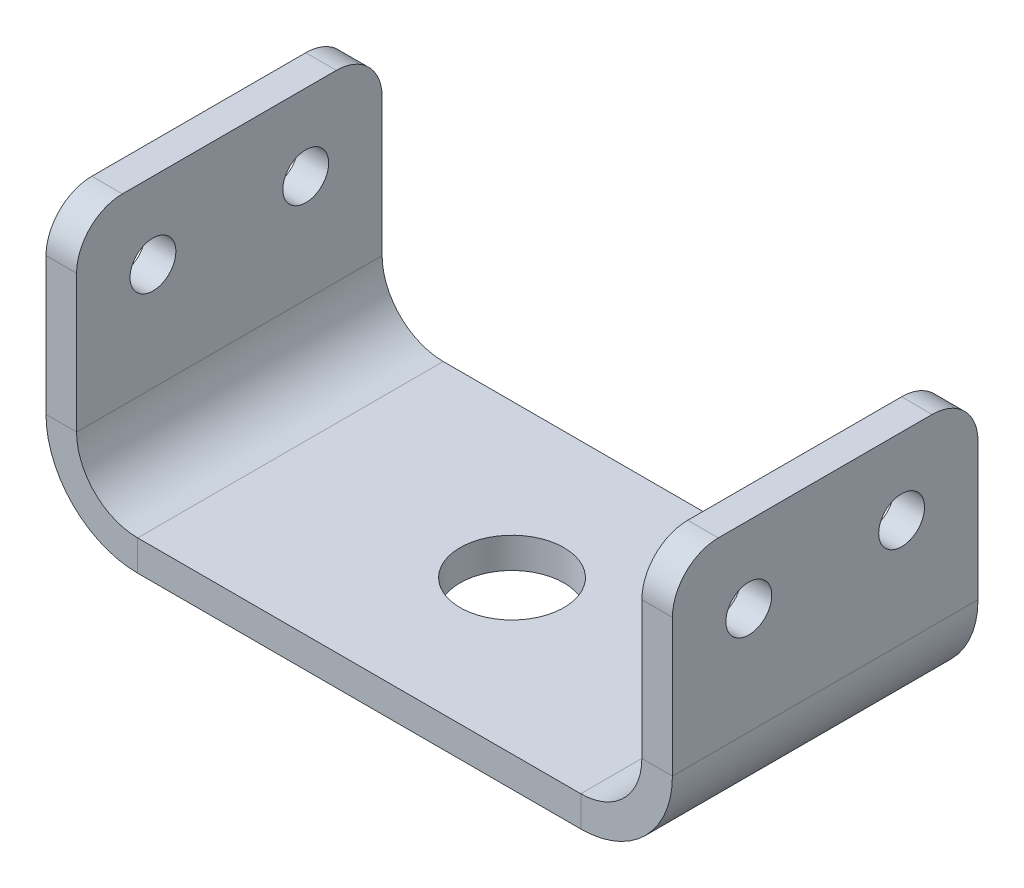
ISO-10303-21;
HEADER;
FILE_DESCRIPTION(('STEP AP214'),'2;1');
FILE_NAME('part.step','',(''),(''),'','','');
FILE_SCHEMA(('AUTOMOTIVE_DESIGN { 1 0 10303 214 1 1 1 1 }'));
ENDSEC;
DATA;
#1=APPLICATION_CONTEXT('core data for automotive mechanical design processes');
#2=APPLICATION_PROTOCOL_DEFINITION('international standard','automotive_design',2000,#1);
#3=PRODUCT_CONTEXT('',#1,'mechanical');
#4=PRODUCT('Part','Part','',(#3));
#5=PRODUCT_RELATED_PRODUCT_CATEGORY('part','',(#4));
#6=PRODUCT_DEFINITION_FORMATION('','',#4);
#7=PRODUCT_DEFINITION_CONTEXT('part definition',#1,'design');
#8=PRODUCT_DEFINITION('design','',#6,#7);
#9=PRODUCT_DEFINITION_SHAPE('','',#8);
#10=(LENGTH_UNIT() NAMED_UNIT(*) SI_UNIT(.MILLI.,.METRE.));
#11=(NAMED_UNIT(*) PLANE_ANGLE_UNIT() SI_UNIT($,.RADIAN.));
#12=(NAMED_UNIT(*) SI_UNIT($,.STERADIAN.) SOLID_ANGLE_UNIT());
#13=UNCERTAINTY_MEASURE_WITH_UNIT(LENGTH_MEASURE(1.E-05),#10,'distance_accuracy_value','');
#14=(GEOMETRIC_REPRESENTATION_CONTEXT(3) GLOBAL_UNCERTAINTY_ASSIGNED_CONTEXT((#13)) GLOBAL_UNIT_ASSIGNED_CONTEXT((#10,
#11,#12)) REPRESENTATION_CONTEXT('',''));
#15=CARTESIAN_POINT('',(0.,0.,0.));
#16=DIRECTION('',(0.,0.,1.));
#17=DIRECTION('',(1.,0.,0.));
#18=AXIS2_PLACEMENT_3D('',#15,#16,#17);
#19=CARTESIAN_POINT('',(20.5,-6.,-10.));
#20=DIRECTION('',(0.,1.,0.));
#21=DIRECTION('',(0.,0.,1.));
#22=AXIS2_PLACEMENT_3D('',#19,#20,#21);
#23=PLANE('',#22);
#24=DIRECTION('',(-1.,0.,0.));
#25=VECTOR('',#24,1.);
#26=CARTESIAN_POINT('',(20.5,-6.,10.));
#27=LINE('',#26,#25);
#28=CARTESIAN_POINT('',(14.5,-6.,10.));
#29=VERTEX_POINT('',#28);
#30=CARTESIAN_POINT('',(-14.5,-6.,10.));
#31=VERTEX_POINT('',#30);
#32=EDGE_CURVE('E129',#29,#31,#27,.T.);
#33=ORIENTED_EDGE('',*,*,#32,.T.);
#34=DIRECTION('',(0.,0.,-1.));
#35=VECTOR('',#34,1.);
#36=CARTESIAN_POINT('',(-14.5,-6.,-10.));
#37=LINE('',#36,#35);
#38=CARTESIAN_POINT('',(-14.5,-6.,-10.));
#39=VERTEX_POINT('',#38);
#40=EDGE_CURVE('E248',#31,#39,#37,.T.);
#41=ORIENTED_EDGE('',*,*,#40,.T.);
#42=DIRECTION('',(-1.,0.,0.));
#43=VECTOR('',#42,1.);
#44=CARTESIAN_POINT('',(20.5,-6.,-10.));
#45=LINE('',#44,#43);
#46=CARTESIAN_POINT('',(14.5,-6.,-10.));
#47=VERTEX_POINT('',#46);
#48=EDGE_CURVE('E404',#47,#39,#45,.T.);
#49=ORIENTED_EDGE('',*,*,#48,.F.);
#50=DIRECTION('',(0.,0.,-1.));
#51=VECTOR('',#50,1.);
#52=CARTESIAN_POINT('',(14.5,-6.,-10.));
#53=LINE('',#52,#51);
#54=EDGE_CURVE('E257',#47,#29,#53,.F.);
#55=ORIENTED_EDGE('',*,*,#54,.T.);
#56=EDGE_LOOP('',(#33,#41,#49,#55));
#57=FACE_BOUND('',#56,.T.);
#58=CARTESIAN_POINT('',(0.,-6.,0.));
#59=DIRECTION('',(0.,1.,0.));
#60=DIRECTION('',(0.,0.,1.));
#61=AXIS2_PLACEMENT_3D('',#58,#59,#60);
#62=CIRCLE('',#61,4.76488561011312);
#63=CARTESIAN_POINT('',(0.,-6.,4.76488561011311));
#64=VERTEX_POINT('',#63);
#65=EDGE_CURVE('E11',#64,#64,#62,.F.);
#66=ORIENTED_EDGE('',*,*,#65,.F.);
#67=EDGE_LOOP('',(#66));
#68=FACE_BOUND('',#67,.T.);
#69=ADVANCED_FACE('F50',(#57,#68),#23,.F.);
#70=CARTESIAN_POINT('',(20.5,-6.,10.));
#71=DIRECTION('',(0.,0.,-1.));
#72=DIRECTION('',(-1.,0.,0.));
#73=AXIS2_PLACEMENT_3D('',#70,#71,#72);
#74=PLANE('',#73);
#75=DIRECTION('',(0.,-1.,0.));
#76=VECTOR('',#75,1.);
#77=CARTESIAN_POINT('',(14.5,-6.,10.));
#78=LINE('',#77,#76);
#79=CARTESIAN_POINT('',(14.5,-4.,10.));
#80=VERTEX_POINT('',#79);
#81=EDGE_CURVE('E60',#80,#29,#78,.T.);
#82=ORIENTED_EDGE('',*,*,#81,.F.);
#83=DIRECTION('',(1.,0.,0.));
#84=VECTOR('',#83,1.);
#85=CARTESIAN_POINT('',(20.5,-4.,10.));
#86=LINE('',#85,#84);
#87=CARTESIAN_POINT('',(-14.5,-4.,10.));
#88=VERTEX_POINT('',#87);
#89=EDGE_CURVE('E126',#80,#88,#86,.F.);
#90=ORIENTED_EDGE('',*,*,#89,.T.);
#91=DIRECTION('',(0.,-1.,0.));
#92=VECTOR('',#91,1.);
#93=CARTESIAN_POINT('',(-14.5,-6.,10.));
#94=LINE('',#93,#92);
#95=EDGE_CURVE('E136',#88,#31,#94,.T.);
#96=ORIENTED_EDGE('',*,*,#95,.T.);
#97=ORIENTED_EDGE('',*,*,#32,.F.);
#98=EDGE_LOOP('',(#82,#90,#96,#97));
#99=FACE_BOUND('',#98,.T.);
#100=ADVANCED_FACE('F123',(#99),#74,.F.);
#101=CARTESIAN_POINT('',(-14.5,0.,10.));
#102=DIRECTION('',(0.,0.,1.));
#103=DIRECTION('',(1.,0.,0.));
#104=AXIS2_PLACEMENT_3D('',#101,#102,#103);
#105=PLANE('',#104);
#106=ORIENTED_EDGE('',*,*,#95,.F.);
#107=CARTESIAN_POINT('',(-14.5,0.,10.));
#108=DIRECTION('',(0.,0.,1.));
#109=DIRECTION('',(0.,-1.,0.));
#110=AXIS2_PLACEMENT_3D('',#107,#108,#109);
#111=CIRCLE('',#110,4.);
#112=CARTESIAN_POINT('',(-18.5,0.,10.));
#113=VERTEX_POINT('',#112);
#114=EDGE_CURVE('E177',#88,#113,#111,.F.);
#115=ORIENTED_EDGE('',*,*,#114,.T.);
#116=DIRECTION('',(-1.,0.,0.));
#117=VECTOR('',#116,1.);
#118=CARTESIAN_POINT('',(-20.5,0.,10.));
#119=LINE('',#118,#117);
#120=CARTESIAN_POINT('',(-20.5,0.,10.));
#121=VERTEX_POINT('',#120);
#122=EDGE_CURVE('E68',#113,#121,#119,.T.);
#123=ORIENTED_EDGE('',*,*,#122,.T.);
#124=CARTESIAN_POINT('',(-14.5,0.,10.));
#125=DIRECTION('',(0.,0.,-1.));
#126=DIRECTION('',(-1.,0.,0.));
#127=AXIS2_PLACEMENT_3D('',#124,#125,#126);
#128=CIRCLE('',#127,6.);
#129=EDGE_CURVE('E265',#31,#121,#128,.T.);
#130=ORIENTED_EDGE('',*,*,#129,.F.);
#131=EDGE_LOOP('',(#106,#115,#123,#130));
#132=FACE_BOUND('',#131,.T.);
#133=ADVANCED_FACE('F330',(#132),#105,.T.);
#134=CARTESIAN_POINT('',(-20.5,0.,10.));
#135=DIRECTION('',(0.,0.,-1.));
#136=DIRECTION('',(0.,-1.,0.));
#137=AXIS2_PLACEMENT_3D('',#134,#135,#136);
#138=PLANE('',#137);
#139=ORIENTED_EDGE('',*,*,#122,.F.);
#140=DIRECTION('',(0.,1.,0.));
#141=VECTOR('',#140,1.);
#142=CARTESIAN_POINT('',(-18.5,0.,10.));
#143=LINE('',#142,#141);
#144=CARTESIAN_POINT('',(-18.5,9.,10.));
#145=VERTEX_POINT('',#144);
#146=EDGE_CURVE('E315',#145,#113,#143,.F.);
#147=ORIENTED_EDGE('',*,*,#146,.F.);
#148=DIRECTION('',(-1.,0.,0.));
#149=VECTOR('',#148,1.);
#150=CARTESIAN_POINT('',(-20.5,9.,10.));
#151=LINE('',#150,#149);
#152=CARTESIAN_POINT('',(-20.5,9.,10.));
#153=VERTEX_POINT('',#152);
#154=EDGE_CURVE('E232',#145,#153,#151,.T.);
#155=ORIENTED_EDGE('',*,*,#154,.T.);
#156=DIRECTION('',(0.,-1.,0.));
#157=VECTOR('',#156,1.);
#158=CARTESIAN_POINT('',(-20.5,0.,10.));
#159=LINE('',#158,#157);
#160=EDGE_CURVE('E344',#153,#121,#159,.T.);
#161=ORIENTED_EDGE('',*,*,#160,.T.);
#162=EDGE_LOOP('',(#139,#147,#155,#161));
#163=FACE_BOUND('',#162,.T.);
#164=ADVANCED_FACE('F341',(#163),#138,.F.);
#165=CARTESIAN_POINT('',(-20.5,9.,7.));
#166=DIRECTION('',(-1.,0.,0.));
#167=DIRECTION('',(0.,0.,1.));
#168=AXIS2_PLACEMENT_3D('',#165,#166,#167);
#169=CYLINDRICAL_SURFACE('',#168,3.);
#170=ORIENTED_EDGE('',*,*,#154,.F.);
#171=CARTESIAN_POINT('',(-18.5,9.,7.));
#172=DIRECTION('',(-1.,0.,0.));
#173=DIRECTION('',(0.,0.,1.));
#174=AXIS2_PLACEMENT_3D('',#171,#172,#173);
#175=CIRCLE('',#174,3.);
#176=CARTESIAN_POINT('',(-18.5,12.,7.));
#177=VERTEX_POINT('',#176);
#178=EDGE_CURVE('E283',#145,#177,#175,.T.);
#179=ORIENTED_EDGE('',*,*,#178,.T.);
#180=DIRECTION('',(-1.,0.,0.));
#181=VECTOR('',#180,1.);
#182=CARTESIAN_POINT('',(-20.5,12.,7.));
#183=LINE('',#182,#181);
#184=CARTESIAN_POINT('',(-20.5,12.,7.));
#185=VERTEX_POINT('',#184);
#186=EDGE_CURVE('E228',#177,#185,#183,.T.);
#187=ORIENTED_EDGE('',*,*,#186,.T.);
#188=CARTESIAN_POINT('',(-20.5,9.,7.));
#189=DIRECTION('',(-1.,0.,0.));
#190=DIRECTION('',(0.,0.,1.));
#191=AXIS2_PLACEMENT_3D('',#188,#189,#190);
#192=CIRCLE('',#191,3.);
#193=EDGE_CURVE('E348',#153,#185,#192,.T.);
#194=ORIENTED_EDGE('',*,*,#193,.F.);
#195=EDGE_LOOP('',(#170,#179,#187,#194));
#196=FACE_BOUND('',#195,.T.);
#197=ADVANCED_FACE('F469',(#196),#169,.T.);
#198=CARTESIAN_POINT('',(-20.5,12.,-10.));
#199=DIRECTION('',(0.,-1.,0.));
#200=DIRECTION('',(0.,0.,1.));
#201=AXIS2_PLACEMENT_3D('',#198,#199,#200);
#202=PLANE('',#201);
#203=ORIENTED_EDGE('',*,*,#186,.F.);
#204=DIRECTION('',(0.,0.,1.));
#205=VECTOR('',#204,1.);
#206=CARTESIAN_POINT('',(-18.5,12.,0.));
#207=LINE('',#206,#205);
#208=CARTESIAN_POINT('',(-18.5,12.,-6.99999999999999));
#209=VERTEX_POINT('',#208);
#210=EDGE_CURVE('E188',#209,#177,#207,.T.);
#211=ORIENTED_EDGE('',*,*,#210,.F.);
#212=DIRECTION('',(-1.,0.,0.));
#213=VECTOR('',#212,1.);
#214=CARTESIAN_POINT('',(-20.5,12.,-6.99999999999999));
#215=LINE('',#214,#213);
#216=CARTESIAN_POINT('',(-20.5,12.,-6.99999999999999));
#217=VERTEX_POINT('',#216);
#218=EDGE_CURVE('E224',#209,#217,#215,.T.);
#219=ORIENTED_EDGE('',*,*,#218,.T.);
#220=DIRECTION('',(0.,0.,1.));
#221=VECTOR('',#220,1.);
#222=CARTESIAN_POINT('',(-20.5,12.,-10.));
#223=LINE('',#222,#221);
#224=EDGE_CURVE('E423',#217,#185,#223,.T.);
#225=ORIENTED_EDGE('',*,*,#224,.T.);
#226=EDGE_LOOP('',(#203,#211,#219,#225));
#227=FACE_BOUND('',#226,.T.);
#228=ADVANCED_FACE('F465',(#227),#202,.F.);
#229=CARTESIAN_POINT('',(-20.5,9.,-6.99999999999999));
#230=DIRECTION('',(-1.,0.,0.));
#231=DIRECTION('',(0.,0.,1.));
#232=AXIS2_PLACEMENT_3D('',#229,#230,#231);
#233=CYLINDRICAL_SURFACE('',#232,3.);
#234=ORIENTED_EDGE('',*,*,#218,.F.);
#235=CARTESIAN_POINT('',(-18.5,9.,-6.99999999999999));
#236=DIRECTION('',(-1.,0.,0.));
#237=DIRECTION('',(0.,0.,1.));
#238=AXIS2_PLACEMENT_3D('',#235,#236,#237);
#239=CIRCLE('',#238,3.);
#240=CARTESIAN_POINT('',(-18.5,9.,-9.99999999999999));
#241=VERTEX_POINT('',#240);
#242=EDGE_CURVE('E316',#209,#241,#239,.T.);
#243=ORIENTED_EDGE('',*,*,#242,.T.);
#244=DIRECTION('',(-1.,0.,0.));
#245=VECTOR('',#244,1.);
#246=CARTESIAN_POINT('',(-20.5,9.,-9.99999999999999));
#247=LINE('',#246,#245);
#248=CARTESIAN_POINT('',(-20.5,9.,-9.99999999999999));
#249=VERTEX_POINT('',#248);
#250=EDGE_CURVE('E220',#241,#249,#247,.T.);
#251=ORIENTED_EDGE('',*,*,#250,.T.);
#252=CARTESIAN_POINT('',(-20.5,9.,-6.99999999999999));
#253=DIRECTION('',(-1.,0.,0.));
#254=DIRECTION('',(0.,0.,1.));
#255=AXIS2_PLACEMENT_3D('',#252,#253,#254);
#256=CIRCLE('',#255,3.);
#257=EDGE_CURVE('E357',#217,#249,#256,.T.);
#258=ORIENTED_EDGE('',*,*,#257,.F.);
#259=EDGE_LOOP('',(#234,#243,#251,#258));
#260=FACE_BOUND('',#259,.T.);
#261=ADVANCED_FACE('F467',(#260),#233,.T.);
#262=CARTESIAN_POINT('',(-20.5,0.,-10.));
#263=DIRECTION('',(0.,0.,1.));
#264=DIRECTION('',(0.,1.,0.));
#265=AXIS2_PLACEMENT_3D('',#262,#263,#264);
#266=PLANE('',#265);
#267=ORIENTED_EDGE('',*,*,#250,.F.);
#268=DIRECTION('',(0.,1.,0.));
#269=VECTOR('',#268,1.);
#270=CARTESIAN_POINT('',(-18.5,0.,-10.));
#271=LINE('',#270,#269);
#272=CARTESIAN_POINT('',(-18.5,0.,-10.));
#273=VERTEX_POINT('',#272);
#274=EDGE_CURVE('E311',#273,#241,#271,.T.);
#275=ORIENTED_EDGE('',*,*,#274,.F.);
#276=DIRECTION('',(-1.,0.,0.));
#277=VECTOR('',#276,1.);
#278=CARTESIAN_POINT('',(-20.5,0.,-10.));
#279=LINE('',#278,#277);
#280=CARTESIAN_POINT('',(-20.5,0.,-10.));
#281=VERTEX_POINT('',#280);
#282=EDGE_CURVE('E217',#273,#281,#279,.T.);
#283=ORIENTED_EDGE('',*,*,#282,.T.);
#284=DIRECTION('',(0.,1.,0.));
#285=VECTOR('',#284,1.);
#286=CARTESIAN_POINT('',(-20.5,0.,-10.));
#287=LINE('',#286,#285);
#288=EDGE_CURVE('E349',#281,#249,#287,.T.);
#289=ORIENTED_EDGE('',*,*,#288,.T.);
#290=EDGE_LOOP('',(#267,#275,#283,#289));
#291=FACE_BOUND('',#290,.T.);
#292=ADVANCED_FACE('F437',(#291),#266,.F.);
#293=CARTESIAN_POINT('',(-14.5,0.,-10.));
#294=DIRECTION('',(0.,0.,1.));
#295=DIRECTION('',(0.,-1.,0.));
#296=AXIS2_PLACEMENT_3D('',#293,#294,#295);
#297=PLANE('',#296);
#298=ORIENTED_EDGE('',*,*,#282,.F.);
#299=CARTESIAN_POINT('',(-14.5,0.,-10.));
#300=DIRECTION('',(0.,0.,1.));
#301=DIRECTION('',(0.,-1.,0.));
#302=AXIS2_PLACEMENT_3D('',#299,#300,#301);
#303=CIRCLE('',#302,4.);
#304=CARTESIAN_POINT('',(-14.5,-4.,-10.));
#305=VERTEX_POINT('',#304);
#306=EDGE_CURVE('E307',#273,#305,#303,.T.);
#307=ORIENTED_EDGE('',*,*,#306,.T.);
#308=DIRECTION('',(0.,-1.,0.));
#309=VECTOR('',#308,1.);
#310=CARTESIAN_POINT('',(-14.5,-6.,-10.));
#311=LINE('',#310,#309);
#312=EDGE_CURVE('E213',#305,#39,#311,.T.);
#313=ORIENTED_EDGE('',*,*,#312,.T.);
#314=CARTESIAN_POINT('',(-14.5,0.,-10.));
#315=DIRECTION('',(0.,0.,-1.));
#316=DIRECTION('',(0.,1.,0.));
#317=AXIS2_PLACEMENT_3D('',#314,#315,#316);
#318=CIRCLE('',#317,6.);
#319=EDGE_CURVE('E261',#281,#39,#318,.F.);
#320=ORIENTED_EDGE('',*,*,#319,.F.);
#321=EDGE_LOOP('',(#298,#307,#313,#320));
#322=FACE_BOUND('',#321,.T.);
#323=ADVANCED_FACE('F439',(#322),#297,.F.);
#324=CARTESIAN_POINT('',(20.5,-6.,-10.));
#325=DIRECTION('',(0.,0.,-1.));
#326=DIRECTION('',(-1.,0.,0.));
#327=AXIS2_PLACEMENT_3D('',#324,#325,#326);
#328=PLANE('',#327);
#329=ORIENTED_EDGE('',*,*,#312,.F.);
#330=DIRECTION('',(1.,0.,0.));
#331=VECTOR('',#330,1.);
#332=CARTESIAN_POINT('',(20.5,-4.,-10.));
#333=LINE('',#332,#331);
#334=CARTESIAN_POINT('',(14.5,-4.,-10.));
#335=VERTEX_POINT('',#334);
#336=EDGE_CURVE('E162',#335,#305,#333,.F.);
#337=ORIENTED_EDGE('',*,*,#336,.F.);
#338=DIRECTION('',(0.,-1.,0.));
#339=VECTOR('',#338,1.);
#340=CARTESIAN_POINT('',(14.5,-6.,-10.));
#341=LINE('',#340,#339);
#342=EDGE_CURVE('E209',#335,#47,#341,.T.);
#343=ORIENTED_EDGE('',*,*,#342,.T.);
#344=ORIENTED_EDGE('',*,*,#48,.T.);
#345=EDGE_LOOP('',(#329,#337,#343,#344));
#346=FACE_BOUND('',#345,.T.);
#347=ADVANCED_FACE('F555',(#346),#328,.T.);
#348=CARTESIAN_POINT('',(14.5,0.,-10.));
#349=DIRECTION('',(0.,0.,-1.));
#350=DIRECTION('',(0.,1.,0.));
#351=AXIS2_PLACEMENT_3D('',#348,#349,#350);
#352=PLANE('',#351);
#353=ORIENTED_EDGE('',*,*,#342,.F.);
#354=CARTESIAN_POINT('',(14.5,0.,-10.));
#355=DIRECTION('',(0.,0.,-1.));
#356=DIRECTION('',(0.,1.,0.));
#357=AXIS2_PLACEMENT_3D('',#354,#355,#356);
#358=CIRCLE('',#357,4.);
#359=CARTESIAN_POINT('',(18.5,0.,-10.));
#360=VERTEX_POINT('',#359);
#361=EDGE_CURVE('E148',#335,#360,#358,.F.);
#362=ORIENTED_EDGE('',*,*,#361,.T.);
#363=DIRECTION('',(1.,0.,0.));
#364=VECTOR('',#363,1.);
#365=CARTESIAN_POINT('',(20.5,0.,-10.));
#366=LINE('',#365,#364);
#367=CARTESIAN_POINT('',(20.5,0.,-10.));
#368=VERTEX_POINT('',#367);
#369=EDGE_CURVE('E205',#360,#368,#366,.T.);
#370=ORIENTED_EDGE('',*,*,#369,.T.);
#371=CARTESIAN_POINT('',(14.5,0.,-10.));
#372=DIRECTION('',(0.,0.,1.));
#373=DIRECTION('',(0.,-1.,0.));
#374=AXIS2_PLACEMENT_3D('',#371,#372,#373);
#375=CIRCLE('',#374,6.);
#376=EDGE_CURVE('E269',#47,#368,#375,.T.);
#377=ORIENTED_EDGE('',*,*,#376,.F.);
#378=EDGE_LOOP('',(#353,#362,#370,#377));
#379=FACE_BOUND('',#378,.T.);
#380=ADVANCED_FACE('F551',(#379),#352,.T.);
#381=CARTESIAN_POINT('',(20.5,0.,-10.));
#382=DIRECTION('',(0.,0.,1.));
#383=DIRECTION('',(0.,1.,0.));
#384=AXIS2_PLACEMENT_3D('',#381,#382,#383);
#385=PLANE('',#384);
#386=ORIENTED_EDGE('',*,*,#369,.F.);
#387=DIRECTION('',(0.,1.,0.));
#388=VECTOR('',#387,1.);
#389=CARTESIAN_POINT('',(18.5,0.,-10.));
#390=LINE('',#389,#388);
#391=CARTESIAN_POINT('',(18.5,9.,-9.99999999999999));
#392=VERTEX_POINT('',#391);
#393=EDGE_CURVE('E291',#360,#392,#390,.T.);
#394=ORIENTED_EDGE('',*,*,#393,.T.);
#395=DIRECTION('',(1.,0.,0.));
#396=VECTOR('',#395,1.);
#397=CARTESIAN_POINT('',(20.5,9.,-9.99999999999999));
#398=LINE('',#397,#396);
#399=CARTESIAN_POINT('',(20.5,9.,-9.99999999999999));
#400=VERTEX_POINT('',#399);
#401=EDGE_CURVE('E201',#392,#400,#398,.T.);
#402=ORIENTED_EDGE('',*,*,#401,.T.);
#403=DIRECTION('',(0.,1.,0.));
#404=VECTOR('',#403,1.);
#405=CARTESIAN_POINT('',(20.5,0.,-10.));
#406=LINE('',#405,#404);
#407=EDGE_CURVE('E379',#368,#400,#406,.T.);
#408=ORIENTED_EDGE('',*,*,#407,.F.);
#409=EDGE_LOOP('',(#386,#394,#402,#408));
#410=FACE_BOUND('',#409,.T.);
#411=ADVANCED_FACE('F547',(#410),#385,.F.);
#412=CARTESIAN_POINT('',(20.5,9.,-6.99999999999999));
#413=DIRECTION('',(-1.,0.,0.));
#414=DIRECTION('',(0.,0.,1.));
#415=AXIS2_PLACEMENT_3D('',#412,#413,#414);
#416=CYLINDRICAL_SURFACE('',#415,3.);
#417=ORIENTED_EDGE('',*,*,#401,.F.);
#418=CARTESIAN_POINT('',(18.5,9.,-6.99999999999999));
#419=DIRECTION('',(-1.,0.,0.));
#420=DIRECTION('',(0.,0.,1.));
#421=AXIS2_PLACEMENT_3D('',#418,#419,#420);
#422=CIRCLE('',#421,3.);
#423=CARTESIAN_POINT('',(18.5,12.,-6.99999999999999));
#424=VERTEX_POINT('',#423);
#425=EDGE_CURVE('E271',#392,#424,#422,.F.);
#426=ORIENTED_EDGE('',*,*,#425,.T.);
#427=DIRECTION('',(1.,0.,0.));
#428=VECTOR('',#427,1.);
#429=CARTESIAN_POINT('',(20.5,12.,-6.99999999999999));
#430=LINE('',#429,#428);
#431=CARTESIAN_POINT('',(20.5,12.,-6.99999999999999));
#432=VERTEX_POINT('',#431);
#433=EDGE_CURVE('E197',#424,#432,#430,.T.);
#434=ORIENTED_EDGE('',*,*,#433,.T.);
#435=CARTESIAN_POINT('',(20.5,9.,-6.99999999999999));
#436=DIRECTION('',(-1.,0.,0.));
#437=DIRECTION('',(0.,0.,1.));
#438=AXIS2_PLACEMENT_3D('',#435,#436,#437);
#439=CIRCLE('',#438,3.);
#440=EDGE_CURVE('E383',#400,#432,#439,.F.);
#441=ORIENTED_EDGE('',*,*,#440,.F.);
#442=EDGE_LOOP('',(#417,#426,#434,#441));
#443=FACE_BOUND('',#442,.T.);
#444=ADVANCED_FACE('F543',(#443),#416,.T.);
#445=CARTESIAN_POINT('',(20.5,12.,-10.));
#446=DIRECTION('',(0.,1.,0.));
#447=DIRECTION('',(0.,0.,-1.));
#448=AXIS2_PLACEMENT_3D('',#445,#446,#447);
#449=PLANE('',#448);
#450=ORIENTED_EDGE('',*,*,#433,.F.);
#451=DIRECTION('',(0.,0.,1.));
#452=VECTOR('',#451,1.);
#453=CARTESIAN_POINT('',(18.5,12.,0.));
#454=LINE('',#453,#452);
#455=CARTESIAN_POINT('',(18.5,12.,7.));
#456=VERTEX_POINT('',#455);
#457=EDGE_CURVE('E287',#456,#424,#454,.F.);
#458=ORIENTED_EDGE('',*,*,#457,.F.);
#459=DIRECTION('',(1.,0.,0.));
#460=VECTOR('',#459,1.);
#461=CARTESIAN_POINT('',(20.5,12.,7.));
#462=LINE('',#461,#460);
#463=CARTESIAN_POINT('',(20.5,12.,7.));
#464=VERTEX_POINT('',#463);
#465=EDGE_CURVE('E193',#456,#464,#462,.T.);
#466=ORIENTED_EDGE('',*,*,#465,.T.);
#467=DIRECTION('',(0.,0.,-1.));
#468=VECTOR('',#467,1.);
#469=CARTESIAN_POINT('',(20.5,12.,-10.));
#470=LINE('',#469,#468);
#471=EDGE_CURVE('E368',#464,#432,#470,.T.);
#472=ORIENTED_EDGE('',*,*,#471,.T.);
#473=EDGE_LOOP('',(#450,#458,#466,#472));
#474=FACE_BOUND('',#473,.T.);
#475=ADVANCED_FACE('F539',(#474),#449,.T.);
#476=CARTESIAN_POINT('',(20.5,9.,7.));
#477=DIRECTION('',(-1.,0.,0.));
#478=DIRECTION('',(0.,0.,1.));
#479=AXIS2_PLACEMENT_3D('',#476,#477,#478);
#480=CYLINDRICAL_SURFACE('',#479,3.);
#481=ORIENTED_EDGE('',*,*,#465,.F.);
#482=CARTESIAN_POINT('',(18.5,9.,7.));
#483=DIRECTION('',(-1.,0.,0.));
#484=DIRECTION('',(0.,0.,1.));
#485=AXIS2_PLACEMENT_3D('',#482,#483,#484);
#486=CIRCLE('',#485,3.);
#487=CARTESIAN_POINT('',(18.5,9.,10.));
#488=VERTEX_POINT('',#487);
#489=EDGE_CURVE('E292',#456,#488,#486,.F.);
#490=ORIENTED_EDGE('',*,*,#489,.T.);
#491=DIRECTION('',(1.,0.,0.));
#492=VECTOR('',#491,1.);
#493=CARTESIAN_POINT('',(20.5,9.,10.));
#494=LINE('',#493,#492);
#495=CARTESIAN_POINT('',(20.5,9.,10.));
#496=VERTEX_POINT('',#495);
#497=EDGE_CURVE('E189',#488,#496,#494,.T.);
#498=ORIENTED_EDGE('',*,*,#497,.T.);
#499=CARTESIAN_POINT('',(20.5,9.,7.));
#500=DIRECTION('',(-1.,0.,0.));
#501=DIRECTION('',(0.,0.,1.));
#502=AXIS2_PLACEMENT_3D('',#499,#500,#501);
#503=CIRCLE('',#502,3.);
#504=EDGE_CURVE('E372',#464,#496,#503,.F.);
#505=ORIENTED_EDGE('',*,*,#504,.F.);
#506=EDGE_LOOP('',(#481,#490,#498,#505));
#507=FACE_BOUND('',#506,.T.);
#508=ADVANCED_FACE('F536',(#507),#480,.T.);
#509=CARTESIAN_POINT('',(20.5,0.,10.));
#510=DIRECTION('',(0.,0.,-1.));
#511=DIRECTION('',(0.,-1.,0.));
#512=AXIS2_PLACEMENT_3D('',#509,#510,#511);
#513=PLANE('',#512);
#514=ORIENTED_EDGE('',*,*,#497,.F.);
#515=DIRECTION('',(0.,1.,0.));
#516=VECTOR('',#515,1.);
#517=CARTESIAN_POINT('',(18.5,0.,10.));
#518=LINE('',#517,#516);
#519=CARTESIAN_POINT('',(18.5,0.,10.));
#520=VERTEX_POINT('',#519);
#521=EDGE_CURVE('E288',#488,#520,#518,.F.);
#522=ORIENTED_EDGE('',*,*,#521,.T.);
#523=DIRECTION('',(1.,0.,0.));
#524=VECTOR('',#523,1.);
#525=CARTESIAN_POINT('',(20.5,0.,10.));
#526=LINE('',#525,#524);
#527=CARTESIAN_POINT('',(20.5,0.,10.));
#528=VERTEX_POINT('',#527);
#529=EDGE_CURVE('E167',#520,#528,#526,.T.);
#530=ORIENTED_EDGE('',*,*,#529,.T.);
#531=DIRECTION('',(0.,-1.,0.));
#532=VECTOR('',#531,1.);
#533=CARTESIAN_POINT('',(20.5,0.,10.));
#534=LINE('',#533,#532);
#535=EDGE_CURVE('E376',#496,#528,#534,.T.);
#536=ORIENTED_EDGE('',*,*,#535,.F.);
#537=EDGE_LOOP('',(#514,#522,#530,#536));
#538=FACE_BOUND('',#537,.T.);
#539=ADVANCED_FACE('F532',(#538),#513,.F.);
#540=CARTESIAN_POINT('',(0.,-6.,0.));
#541=DIRECTION('',(0.,1.,0.));
#542=DIRECTION('',(0.,0.,1.));
#543=AXIS2_PLACEMENT_3D('',#540,#541,#542);
#544=CYLINDRICAL_SURFACE('',#543,3.4);
#545=CARTESIAN_POINT('',(0.,-6.,0.));
#546=DIRECTION('',(0.,-1.,0.));
#547=DIRECTION('',(0.,0.,-1.));
#548=AXIS2_PLACEMENT_3D('',#545,#546,#547);
#549=CIRCLE('',#548,3.4);
#550=CARTESIAN_POINT('',(0.,-6.,-3.4));
#551=VERTEX_POINT('',#550);
#552=EDGE_CURVE('E397',#551,#551,#549,.T.);
#553=ORIENTED_EDGE('',*,*,#552,.T.);
#554=EDGE_LOOP('',(#553));
#555=FACE_BOUND('',#554,.T.);
#556=CARTESIAN_POINT('',(0.,-4.,0.));
#557=DIRECTION('',(0.,-1.,0.));
#558=DIRECTION('',(0.,0.,-1.));
#559=AXIS2_PLACEMENT_3D('',#556,#557,#558);
#560=CIRCLE('',#559,3.4);
#561=CARTESIAN_POINT('',(0.,-4.,-3.4));
#562=VERTEX_POINT('',#561);
#563=EDGE_CURVE('E170',#562,#562,#560,.T.);
#564=ORIENTED_EDGE('',*,*,#563,.F.);
#565=EDGE_LOOP('',(#564));
#566=FACE_BOUND('',#565,.T.);
#567=ADVANCED_FACE('F535',(#555,#566),#544,.F.);
#568=CARTESIAN_POINT('',(-20.5,7.,-5.));
#569=DIRECTION('',(-1.,0.,0.));
#570=DIRECTION('',(0.,0.,1.));
#571=AXIS2_PLACEMENT_3D('',#568,#569,#570);
#572=CYLINDRICAL_SURFACE('',#571,1.5);
#573=CARTESIAN_POINT('',(-20.5,7.,-5.));
#574=DIRECTION('',(-1.,0.,0.));
#575=DIRECTION('',(0.,0.,1.));
#576=AXIS2_PLACEMENT_3D('',#573,#574,#575);
#577=CIRCLE('',#576,1.5);
#578=CARTESIAN_POINT('',(-20.5,7.,-3.5));
#579=VERTEX_POINT('',#578);
#580=EDGE_CURVE('E415',#579,#579,#577,.T.);
#581=ORIENTED_EDGE('',*,*,#580,.T.);
#582=EDGE_LOOP('',(#581));
#583=FACE_BOUND('',#582,.T.);
#584=CARTESIAN_POINT('',(-18.5,7.,-5.));
#585=DIRECTION('',(-1.,0.,0.));
#586=DIRECTION('',(0.,0.,1.));
#587=AXIS2_PLACEMENT_3D('',#584,#585,#586);
#588=CIRCLE('',#587,1.5);
#589=CARTESIAN_POINT('',(-18.5,7.,-3.5));
#590=VERTEX_POINT('',#589);
#591=EDGE_CURVE('E161',#590,#590,#588,.T.);
#592=ORIENTED_EDGE('',*,*,#591,.F.);
#593=EDGE_LOOP('',(#592));
#594=FACE_BOUND('',#593,.T.);
#595=ADVANCED_FACE('F611',(#583,#594),#572,.F.);
#596=CARTESIAN_POINT('',(-20.5,7.,5.));
#597=DIRECTION('',(-1.,0.,0.));
#598=DIRECTION('',(0.,0.,1.));
#599=AXIS2_PLACEMENT_3D('',#596,#597,#598);
#600=CYLINDRICAL_SURFACE('',#599,1.5);
#601=CARTESIAN_POINT('',(-20.5,7.,5.));
#602=DIRECTION('',(-1.,0.,0.));
#603=DIRECTION('',(0.,0.,1.));
#604=AXIS2_PLACEMENT_3D('',#601,#602,#603);
#605=CIRCLE('',#604,1.5);
#606=CARTESIAN_POINT('',(-20.5,7.,6.5));
#607=VERTEX_POINT('',#606);
#608=EDGE_CURVE('E419',#607,#607,#605,.T.);
#609=ORIENTED_EDGE('',*,*,#608,.T.);
#610=EDGE_LOOP('',(#609));
#611=FACE_BOUND('',#610,.T.);
#612=CARTESIAN_POINT('',(-18.5,7.,5.));
#613=DIRECTION('',(-1.,0.,0.));
#614=DIRECTION('',(0.,0.,1.));
#615=AXIS2_PLACEMENT_3D('',#612,#613,#614);
#616=CIRCLE('',#615,1.5);
#617=CARTESIAN_POINT('',(-18.5,7.,6.5));
#618=VERTEX_POINT('',#617);
#619=EDGE_CURVE('E184',#618,#618,#616,.T.);
#620=ORIENTED_EDGE('',*,*,#619,.F.);
#621=EDGE_LOOP('',(#620));
#622=FACE_BOUND('',#621,.T.);
#623=ADVANCED_FACE('F52',(#611,#622),#600,.F.);
#624=CARTESIAN_POINT('',(20.5,7.,-5.));
#625=DIRECTION('',(-1.,0.,0.));
#626=DIRECTION('',(0.,0.,1.));
#627=AXIS2_PLACEMENT_3D('',#624,#625,#626);
#628=CYLINDRICAL_SURFACE('',#627,1.5);
#629=CARTESIAN_POINT('',(20.5,7.,-5.));
#630=DIRECTION('',(-1.,0.,0.));
#631=DIRECTION('',(0.,0.,1.));
#632=AXIS2_PLACEMENT_3D('',#629,#630,#631);
#633=CIRCLE('',#632,1.5);
#634=CARTESIAN_POINT('',(20.5,7.,-3.5));
#635=VERTEX_POINT('',#634);
#636=EDGE_CURVE('E354',#635,#635,#633,.T.);
#637=ORIENTED_EDGE('',*,*,#636,.F.);
#638=EDGE_LOOP('',(#637));
#639=FACE_BOUND('',#638,.T.);
#640=CARTESIAN_POINT('',(18.5,7.,-5.));
#641=DIRECTION('',(-1.,0.,0.));
#642=DIRECTION('',(0.,0.,1.));
#643=AXIS2_PLACEMENT_3D('',#640,#641,#642);
#644=CIRCLE('',#643,1.5);
#645=CARTESIAN_POINT('',(18.5,7.,-3.5));
#646=VERTEX_POINT('',#645);
#647=EDGE_CURVE('E278',#646,#646,#644,.T.);
#648=ORIENTED_EDGE('',*,*,#647,.T.);
#649=EDGE_LOOP('',(#648));
#650=FACE_BOUND('',#649,.T.);
#651=ADVANCED_FACE('F524',(#639,#650),#628,.F.);
#652=CARTESIAN_POINT('',(20.5,7.,5.));
#653=DIRECTION('',(-1.,0.,0.));
#654=DIRECTION('',(0.,0.,1.));
#655=AXIS2_PLACEMENT_3D('',#652,#653,#654);
#656=CYLINDRICAL_SURFACE('',#655,1.5);
#657=CARTESIAN_POINT('',(20.5,7.,5.));
#658=DIRECTION('',(-1.,0.,0.));
#659=DIRECTION('',(0.,0.,1.));
#660=AXIS2_PLACEMENT_3D('',#657,#658,#659);
#661=CIRCLE('',#660,1.5);
#662=CARTESIAN_POINT('',(20.5,7.,6.5));
#663=VERTEX_POINT('',#662);
#664=EDGE_CURVE('E364',#663,#663,#661,.T.);
#665=ORIENTED_EDGE('',*,*,#664,.F.);
#666=EDGE_LOOP('',(#665));
#667=FACE_BOUND('',#666,.T.);
#668=CARTESIAN_POINT('',(18.5,7.,5.));
#669=DIRECTION('',(-1.,0.,0.));
#670=DIRECTION('',(0.,0.,1.));
#671=AXIS2_PLACEMENT_3D('',#668,#669,#670);
#672=CIRCLE('',#671,1.5);
#673=CARTESIAN_POINT('',(18.5,7.,6.5));
#674=VERTEX_POINT('',#673);
#675=EDGE_CURVE('E282',#674,#674,#672,.T.);
#676=ORIENTED_EDGE('',*,*,#675,.T.);
#677=EDGE_LOOP('',(#676));
#678=FACE_BOUND('',#677,.T.);
#679=ADVANCED_FACE('F527',(#667,#678),#656,.F.);
#680=CARTESIAN_POINT('',(14.5,0.,10.));
#681=DIRECTION('',(0.,0.,-1.));
#682=DIRECTION('',(-1.,0.,0.));
#683=AXIS2_PLACEMENT_3D('',#680,#681,#682);
#684=PLANE('',#683);
#685=CARTESIAN_POINT('',(14.5,0.,10.));
#686=DIRECTION('',(0.,0.,-1.));
#687=DIRECTION('',(0.,1.,0.));
#688=AXIS2_PLACEMENT_3D('',#685,#686,#687);
#689=CIRCLE('',#688,4.);
#690=EDGE_CURVE('E145',#520,#80,#689,.T.);
#691=ORIENTED_EDGE('',*,*,#690,.T.);
#692=ORIENTED_EDGE('',*,*,#81,.T.);
#693=CARTESIAN_POINT('',(14.5,0.,10.));
#694=DIRECTION('',(0.,0.,1.));
#695=DIRECTION('',(1.,0.,0.));
#696=AXIS2_PLACEMENT_3D('',#693,#694,#695);
#697=CIRCLE('',#696,6.);
#698=EDGE_CURVE('E395',#528,#29,#697,.F.);
#699=ORIENTED_EDGE('',*,*,#698,.F.);
#700=ORIENTED_EDGE('',*,*,#529,.F.);
#701=EDGE_LOOP('',(#691,#692,#699,#700));
#702=FACE_BOUND('',#701,.T.);
#703=ADVANCED_FACE('F165',(#702),#684,.F.);
#704=CARTESIAN_POINT('',(20.5,0.,0.));
#705=DIRECTION('',(-1.,0.,0.));
#706=DIRECTION('',(0.,0.,1.));
#707=AXIS2_PLACEMENT_3D('',#704,#705,#706);
#708=PLANE('',#707);
#709=ORIENTED_EDGE('',*,*,#636,.T.);
#710=EDGE_LOOP('',(#709));
#711=FACE_BOUND('',#710,.T.);
#712=ORIENTED_EDGE('',*,*,#664,.T.);
#713=EDGE_LOOP('',(#712));
#714=FACE_BOUND('',#713,.T.);
#715=ORIENTED_EDGE('',*,*,#535,.T.);
#716=DIRECTION('',(0.,0.,-1.));
#717=VECTOR('',#716,1.);
#718=CARTESIAN_POINT('',(20.5,0.,0.));
#719=LINE('',#718,#717);
#720=EDGE_CURVE('E387',#528,#368,#719,.T.);
#721=ORIENTED_EDGE('',*,*,#720,.T.);
#722=ORIENTED_EDGE('',*,*,#407,.T.);
#723=ORIENTED_EDGE('',*,*,#440,.T.);
#724=ORIENTED_EDGE('',*,*,#471,.F.);
#725=ORIENTED_EDGE('',*,*,#504,.T.);
#726=EDGE_LOOP('',(#715,#721,#722,#723,#724,#725));
#727=FACE_BOUND('',#726,.T.);
#728=ADVANCED_FACE('F496',(#711,#714,#727),#708,.F.);
#729=CARTESIAN_POINT('',(-20.5,0.,0.));
#730=DIRECTION('',(-1.,0.,0.));
#731=DIRECTION('',(0.,0.,1.));
#732=AXIS2_PLACEMENT_3D('',#729,#730,#731);
#733=PLANE('',#732);
#734=ORIENTED_EDGE('',*,*,#580,.F.);
#735=EDGE_LOOP('',(#734));
#736=FACE_BOUND('',#735,.T.);
#737=ORIENTED_EDGE('',*,*,#608,.F.);
#738=EDGE_LOOP('',(#737));
#739=FACE_BOUND('',#738,.T.);
#740=ORIENTED_EDGE('',*,*,#288,.F.);
#741=DIRECTION('',(0.,0.,-1.));
#742=VECTOR('',#741,1.);
#743=CARTESIAN_POINT('',(-20.5,0.,10.));
#744=LINE('',#743,#742);
#745=EDGE_CURVE('E240',#281,#121,#744,.F.);
#746=ORIENTED_EDGE('',*,*,#745,.T.);
#747=ORIENTED_EDGE('',*,*,#160,.F.);
#748=ORIENTED_EDGE('',*,*,#193,.T.);
#749=ORIENTED_EDGE('',*,*,#224,.F.);
#750=ORIENTED_EDGE('',*,*,#257,.T.);
#751=EDGE_LOOP('',(#740,#746,#747,#748,#749,#750));
#752=FACE_BOUND('',#751,.T.);
#753=ADVANCED_FACE('F432',(#736,#739,#752),#733,.T.);
#754=ORIENTED_EDGE('',*,*,#65,.T.);
#755=EDGE_LOOP('',(#754));
#756=FACE_BOUND('',#755,.T.);
#757=ORIENTED_EDGE('',*,*,#552,.F.);
#758=EDGE_LOOP('',(#757));
#759=FACE_BOUND('',#758,.T.);
#760=ADVANCED_FACE('F481',(#756,#759),#23,.F.);
#761=CARTESIAN_POINT('',(14.5,0.,0.));
#762=DIRECTION('',(0.,0.,-1.));
#763=DIRECTION('',(0.,1.,0.));
#764=AXIS2_PLACEMENT_3D('',#761,#762,#763);
#765=CYLINDRICAL_SURFACE('',#764,6.);
#766=ORIENTED_EDGE('',*,*,#698,.T.);
#767=ORIENTED_EDGE('',*,*,#54,.F.);
#768=ORIENTED_EDGE('',*,*,#376,.T.);
#769=ORIENTED_EDGE('',*,*,#720,.F.);
#770=EDGE_LOOP('',(#766,#767,#768,#769));
#771=FACE_BOUND('',#770,.T.);
#772=ADVANCED_FACE('F489',(#771),#765,.T.);
#773=CARTESIAN_POINT('',(-14.5,0.,-10.));
#774=DIRECTION('',(0.,0.,1.));
#775=DIRECTION('',(0.,-1.,0.));
#776=AXIS2_PLACEMENT_3D('',#773,#774,#775);
#777=CYLINDRICAL_SURFACE('',#776,6.);
#778=ORIENTED_EDGE('',*,*,#129,.T.);
#779=ORIENTED_EDGE('',*,*,#745,.F.);
#780=ORIENTED_EDGE('',*,*,#319,.T.);
#781=ORIENTED_EDGE('',*,*,#40,.F.);
#782=EDGE_LOOP('',(#778,#779,#780,#781));
#783=FACE_BOUND('',#782,.T.);
#784=ADVANCED_FACE('F443',(#783),#777,.T.);
#785=CARTESIAN_POINT('',(18.5,0.,0.));
#786=DIRECTION('',(-1.,0.,0.));
#787=DIRECTION('',(0.,0.,1.));
#788=AXIS2_PLACEMENT_3D('',#785,#786,#787);
#789=PLANE('',#788);
#790=ORIENTED_EDGE('',*,*,#647,.F.);
#791=EDGE_LOOP('',(#790));
#792=FACE_BOUND('',#791,.T.);
#793=ORIENTED_EDGE('',*,*,#675,.F.);
#794=EDGE_LOOP('',(#793));
#795=FACE_BOUND('',#794,.T.);
#796=ORIENTED_EDGE('',*,*,#521,.F.);
#797=ORIENTED_EDGE('',*,*,#489,.F.);
#798=ORIENTED_EDGE('',*,*,#457,.T.);
#799=ORIENTED_EDGE('',*,*,#425,.F.);
#800=ORIENTED_EDGE('',*,*,#393,.F.);
#801=DIRECTION('',(0.,0.,1.));
#802=VECTOR('',#801,1.);
#803=CARTESIAN_POINT('',(18.5,0.,0.));
#804=LINE('',#803,#802);
#805=EDGE_CURVE('E154',#520,#360,#804,.F.);
#806=ORIENTED_EDGE('',*,*,#805,.F.);
#807=EDGE_LOOP('',(#796,#797,#798,#799,#800,#806));
#808=FACE_BOUND('',#807,.T.);
#809=ADVANCED_FACE('F510',(#792,#795,#808),#789,.T.);
#810=CARTESIAN_POINT('',(-18.5,0.,0.));
#811=DIRECTION('',(-1.,0.,0.));
#812=DIRECTION('',(0.,0.,1.));
#813=AXIS2_PLACEMENT_3D('',#810,#811,#812);
#814=PLANE('',#813);
#815=ORIENTED_EDGE('',*,*,#591,.T.);
#816=EDGE_LOOP('',(#815));
#817=FACE_BOUND('',#816,.T.);
#818=ORIENTED_EDGE('',*,*,#619,.T.);
#819=EDGE_LOOP('',(#818));
#820=FACE_BOUND('',#819,.T.);
#821=ORIENTED_EDGE('',*,*,#274,.T.);
#822=ORIENTED_EDGE('',*,*,#242,.F.);
#823=ORIENTED_EDGE('',*,*,#210,.T.);
#824=ORIENTED_EDGE('',*,*,#178,.F.);
#825=ORIENTED_EDGE('',*,*,#146,.T.);
#826=DIRECTION('',(0.,0.,1.));
#827=VECTOR('',#826,1.);
#828=CARTESIAN_POINT('',(-18.5,0.,0.));
#829=LINE('',#828,#827);
#830=EDGE_CURVE('E266',#273,#113,#829,.T.);
#831=ORIENTED_EDGE('',*,*,#830,.F.);
#832=EDGE_LOOP('',(#821,#822,#823,#824,#825,#831));
#833=FACE_BOUND('',#832,.T.);
#834=ADVANCED_FACE('F339',(#817,#820,#833),#814,.F.);
#835=CARTESIAN_POINT('',(20.5,-4.,-10.));
#836=DIRECTION('',(0.,1.,0.));
#837=DIRECTION('',(0.,0.,1.));
#838=AXIS2_PLACEMENT_3D('',#835,#836,#837);
#839=PLANE('',#838);
#840=ORIENTED_EDGE('',*,*,#563,.T.);
#841=EDGE_LOOP('',(#840));
#842=FACE_BOUND('',#841,.T.);
#843=ORIENTED_EDGE('',*,*,#89,.F.);
#844=DIRECTION('',(0.,0.,1.));
#845=VECTOR('',#844,1.);
#846=CARTESIAN_POINT('',(14.5,-4.,-10.));
#847=LINE('',#846,#845);
#848=EDGE_CURVE('E142',#335,#80,#847,.T.);
#849=ORIENTED_EDGE('',*,*,#848,.F.);
#850=ORIENTED_EDGE('',*,*,#336,.T.);
#851=DIRECTION('',(0.,0.,1.));
#852=VECTOR('',#851,1.);
#853=CARTESIAN_POINT('',(-14.5,-4.,-10.));
#854=LINE('',#853,#852);
#855=EDGE_CURVE('E153',#88,#305,#854,.F.);
#856=ORIENTED_EDGE('',*,*,#855,.F.);
#857=EDGE_LOOP('',(#843,#849,#850,#856));
#858=FACE_BOUND('',#857,.T.);
#859=ADVANCED_FACE('F157',(#842,#858),#839,.T.);
#860=CARTESIAN_POINT('',(14.5,0.,0.));
#861=DIRECTION('',(0.,0.,-1.));
#862=DIRECTION('',(0.,1.,0.));
#863=AXIS2_PLACEMENT_3D('',#860,#861,#862);
#864=CYLINDRICAL_SURFACE('',#863,4.);
#865=ORIENTED_EDGE('',*,*,#690,.F.);
#866=ORIENTED_EDGE('',*,*,#805,.T.);
#867=ORIENTED_EDGE('',*,*,#361,.F.);
#868=ORIENTED_EDGE('',*,*,#848,.T.);
#869=EDGE_LOOP('',(#865,#866,#867,#868));
#870=FACE_BOUND('',#869,.T.);
#871=ADVANCED_FACE('F143',(#870),#864,.F.);
#872=CARTESIAN_POINT('',(-14.5,0.,-10.));
#873=DIRECTION('',(0.,0.,1.));
#874=DIRECTION('',(0.,-1.,0.));
#875=AXIS2_PLACEMENT_3D('',#872,#873,#874);
#876=CYLINDRICAL_SURFACE('',#875,4.);
#877=ORIENTED_EDGE('',*,*,#114,.F.);
#878=ORIENTED_EDGE('',*,*,#855,.T.);
#879=ORIENTED_EDGE('',*,*,#306,.F.);
#880=ORIENTED_EDGE('',*,*,#830,.T.);
#881=EDGE_LOOP('',(#877,#878,#879,#880));
#882=FACE_BOUND('',#881,.T.);
#883=ADVANCED_FACE('F332',(#882),#876,.F.);
#884=CLOSED_SHELL('',(#69,#100,#133,#164,#197,#228,#261,#292,#323,#347,#380,#411,#444,#475,#508,
#539,#567,#595,#623,#651,#679,#703,#728,#753,#760,#772,#784,#809,#834,#859,#871,#883));
#885=MANIFOLD_SOLID_BREP('B2',#884);
#886=ADVANCED_BREP_SHAPE_REPRESENTATION('',(#18,#885),#14);
#887=SHAPE_DEFINITION_REPRESENTATION(#9,#886);
ENDSEC;
END-ISO-10303-21;
